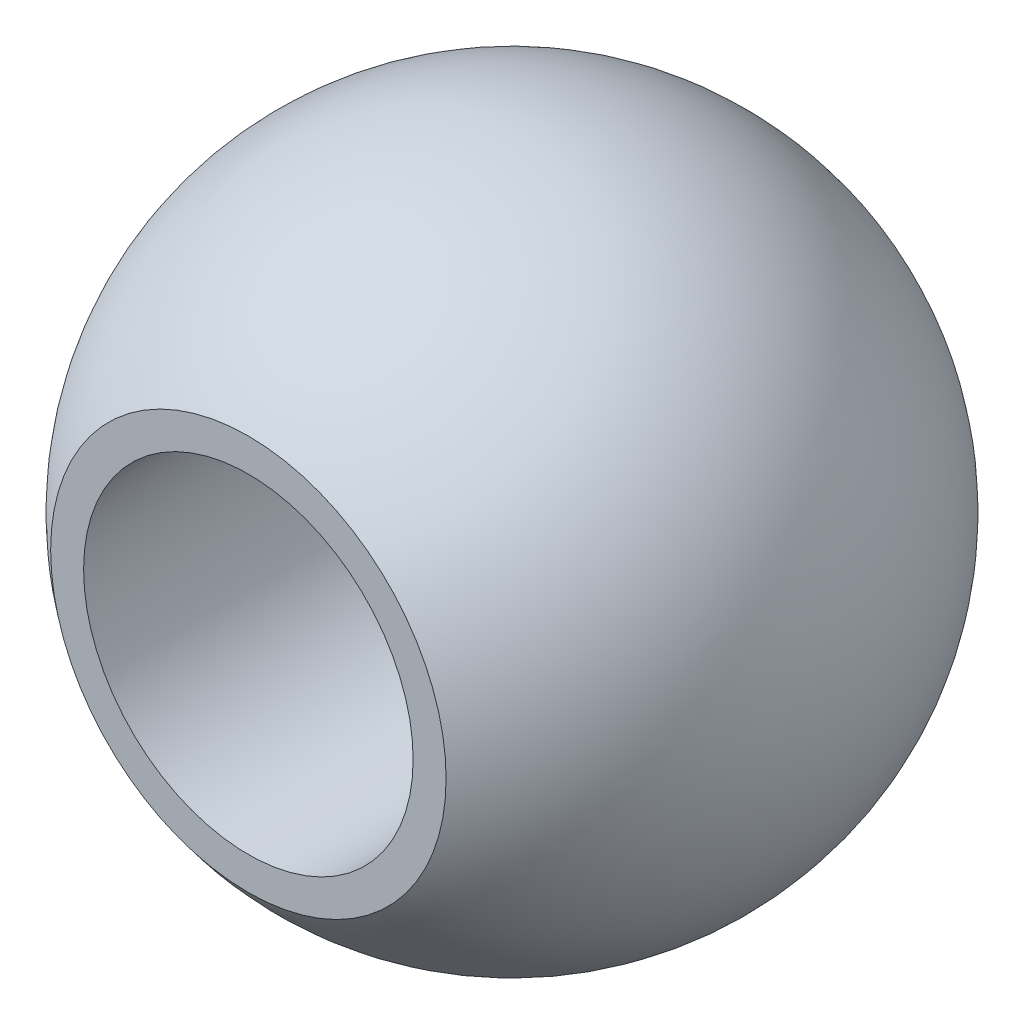
ISO-10303-21;
HEADER;
FILE_DESCRIPTION(('STEP AP214'),'2;1');
FILE_NAME('part.step','',(''),(''),'','','');
FILE_SCHEMA(('AUTOMOTIVE_DESIGN { 1 0 10303 214 1 1 1 1 }'));
ENDSEC;
DATA;
#1=APPLICATION_CONTEXT('core data for automotive mechanical design processes');
#2=APPLICATION_PROTOCOL_DEFINITION('international standard','automotive_design',2000,#1);
#3=PRODUCT_CONTEXT('',#1,'mechanical');
#4=PRODUCT('Part','Part','',(#3));
#5=PRODUCT_RELATED_PRODUCT_CATEGORY('part','',(#4));
#6=PRODUCT_DEFINITION_FORMATION('','',#4);
#7=PRODUCT_DEFINITION_CONTEXT('part definition',#1,'design');
#8=PRODUCT_DEFINITION('design','',#6,#7);
#9=PRODUCT_DEFINITION_SHAPE('','',#8);
#10=(LENGTH_UNIT() NAMED_UNIT(*) SI_UNIT(.MILLI.,.METRE.));
#11=(NAMED_UNIT(*) PLANE_ANGLE_UNIT() SI_UNIT($,.RADIAN.));
#12=(NAMED_UNIT(*) SI_UNIT($,.STERADIAN.) SOLID_ANGLE_UNIT());
#13=UNCERTAINTY_MEASURE_WITH_UNIT(LENGTH_MEASURE(1.E-05),#10,'distance_accuracy_value','');
#14=(GEOMETRIC_REPRESENTATION_CONTEXT(3) GLOBAL_UNCERTAINTY_ASSIGNED_CONTEXT((#13)) GLOBAL_UNIT_ASSIGNED_CONTEXT((#10,
#11,#12)) REPRESENTATION_CONTEXT('',''));
#15=CARTESIAN_POINT('',(0.,0.,0.));
#16=DIRECTION('',(0.,0.,1.));
#17=DIRECTION('',(1.,0.,0.));
#18=AXIS2_PLACEMENT_3D('',#15,#16,#17);
#19=CARTESIAN_POINT('',(0.,0.,-4.));
#20=DIRECTION('',(0.,0.,1.));
#21=DIRECTION('',(1.,0.,0.));
#22=AXIS2_PLACEMENT_3D('',#19,#20,#21);
#23=PLANE('',#22);
#24=CARTESIAN_POINT('',(0.,0.,-4.));
#25=DIRECTION('',(0.,0.,-1.));
#26=DIRECTION('',(-1.,0.,0.));
#27=AXIS2_PLACEMENT_3D('',#24,#25,#26);
#28=CIRCLE('',#27,2.5);
#29=CARTESIAN_POINT('',(-2.5,0.,-4.));
#30=VERTEX_POINT('',#29);
#31=EDGE_CURVE('E48',#30,#30,#28,.T.);
#32=ORIENTED_EDGE('',*,*,#31,.F.);
#33=EDGE_LOOP('',(#32));
#34=FACE_BOUND('',#33,.T.);
#35=CARTESIAN_POINT('',(0.,0.,-4.));
#36=DIRECTION('',(0.,0.,-1.));
#37=DIRECTION('',(-1.,0.,0.));
#38=AXIS2_PLACEMENT_3D('',#35,#36,#37);
#39=CIRCLE('',#38,3.);
#40=CARTESIAN_POINT('',(0.,3.,-4.));
#41=VERTEX_POINT('',#40);
#42=EDGE_CURVE('E10',#41,#41,#39,.T.);
#43=ORIENTED_EDGE('',*,*,#42,.T.);
#44=EDGE_LOOP('',(#43));
#45=FACE_BOUND('',#44,.T.);
#46=ADVANCED_FACE('F34',(#34,#45),#23,.F.);
#47=CARTESIAN_POINT('',(0.,0.,0.));
#48=DIRECTION('',(0.,0.,-1.));
#49=DIRECTION('',(0.,1.,0.));
#50=AXIS2_PLACEMENT_3D('',#47,#48,#49);
#51=SPHERICAL_SURFACE('',#50,5.);
#52=CARTESIAN_POINT('',(0.,0.,4.));
#53=DIRECTION('',(0.,0.,-1.));
#54=DIRECTION('',(-1.,0.,0.));
#55=AXIS2_PLACEMENT_3D('',#52,#53,#54);
#56=CIRCLE('',#55,3.);
#57=CARTESIAN_POINT('',(0.,3.,4.));
#58=VERTEX_POINT('',#57);
#59=EDGE_CURVE('E40',#58,#58,#56,.T.);
#60=CARTESIAN_POINT('',(0.,3.,4.));
#61=CARTESIAN_POINT('',(0.,3.077276775515,3.94204663170657));
#62=CARTESIAN_POINT('',(0.,3.1528698608554,3.88184890774128));
#63=CARTESIAN_POINT('',(0.,3.30044437808252,3.7571782118284));
#64=CARTESIAN_POINT('',(0.,3.37242580996924,3.69270523988082));
#65=CARTESIAN_POINT('',(0.,3.51253274718454,3.55969751136479));
#66=CARTESIAN_POINT('',(0.,3.58065825251311,3.49116275479634));
#67=CARTESIAN_POINT('',(0.,3.7128252611481,3.3502624063782));
#68=CARTESIAN_POINT('',(0.,3.77686676445451,3.2778968145285));
#69=CARTESIAN_POINT('',(0.,3.90065053673076,3.12957757792917));
#70=CARTESIAN_POINT('',(0.,3.96039280570059,3.05362393317954));
#71=CARTESIAN_POINT('',(0.,4.07537754692509,2.89838369785238));
#72=CARTESIAN_POINT('',(0.,4.13062001917976,2.81909710727485));
#73=CARTESIAN_POINT('',(0.,4.23641965218175,2.6574572052343));
#74=CARTESIAN_POINT('',(0.,4.28697681292907,2.57510389377129));
#75=CARTESIAN_POINT('',(0.,4.38323605792731,2.40760709263323));
#76=CARTESIAN_POINT('',(0.,4.42893814217822,2.32246360295818));
#77=CARTESIAN_POINT('',(0.,4.51533376782094,2.1496723520414));
#78=CARTESIAN_POINT('',(0.,4.55602730921274,2.06202459079966));
#79=CARTESIAN_POINT('',(0.,4.63226920242471,1.88451911404273));
#80=CARTESIAN_POINT('',(0.,4.66781755424486,1.79466139852752));
#81=CARTESIAN_POINT('',(0.,4.73364969857936,1.6130377510562));
#82=CARTESIAN_POINT('',(0.,4.76393349109371,1.52127181910009));
#83=CARTESIAN_POINT('',(0.,4.81913482530724,1.3361398843813));
#84=CARTESIAN_POINT('',(0.,4.84405236700642,1.24277388161863));
#85=CARTESIAN_POINT('',(0.,4.88843752767088,1.05475532385498));
#86=CARTESIAN_POINT('',(0.,4.90790514663615,0.960102768854005));
#87=CARTESIAN_POINT('',(0.,4.94132509050021,0.769828945370247));
#88=CARTESIAN_POINT('',(0.,4.95527741539901,0.674207676887465));
#89=CARTESIAN_POINT('',(0.,4.97761991988975,0.482317518088197));
#90=CARTESIAN_POINT('',(0.,4.98601009948169,0.386048627771711));
#91=CARTESIAN_POINT('',(0.,4.99720013953681,0.193186491636817));
#92=CARTESIAN_POINT('',(0.,5.,0.0965932458184087));
#93=CARTESIAN_POINT('',(0.,5.,-0.0965932458184075));
#94=CARTESIAN_POINT('',(0.,4.99720013953681,-0.193186491636816));
#95=CARTESIAN_POINT('',(0.,4.98601009948169,-0.38604862777171));
#96=CARTESIAN_POINT('',(0.,4.97761991988975,-0.482317518088196));
#97=CARTESIAN_POINT('',(0.,4.95527741539901,-0.674207676887464));
#98=CARTESIAN_POINT('',(0.,4.94132509050021,-0.769828945370246));
#99=CARTESIAN_POINT('',(0.,4.90790514663615,-0.960102768854004));
#100=CARTESIAN_POINT('',(0.,4.88843752767088,-1.05475532385498));
#101=CARTESIAN_POINT('',(0.,4.84405236700642,-1.24277388161863));
#102=CARTESIAN_POINT('',(0.,4.81913482530724,-1.3361398843813));
#103=CARTESIAN_POINT('',(0.,4.76393349109371,-1.52127181910009));
#104=CARTESIAN_POINT('',(0.,4.73364969857936,-1.6130377510562));
#105=CARTESIAN_POINT('',(0.,4.66781755424486,-1.79466139852752));
#106=CARTESIAN_POINT('',(0.,4.63226920242471,-1.88451911404272));
#107=CARTESIAN_POINT('',(0.,4.55602730921274,-2.06202459079966));
#108=CARTESIAN_POINT('',(0.,4.51533376782094,-2.1496723520414));
#109=CARTESIAN_POINT('',(0.,4.42893814217822,-2.32246360295818));
#110=CARTESIAN_POINT('',(0.,4.38323605792731,-2.40760709263323));
#111=CARTESIAN_POINT('',(0.,4.28697681292907,-2.57510389377129));
#112=CARTESIAN_POINT('',(0.,4.23641965218176,-2.6574572052343));
#113=CARTESIAN_POINT('',(0.,4.13062001917976,-2.81909710727484));
#114=CARTESIAN_POINT('',(0.,4.07537754692509,-2.89838369785238));
#115=CARTESIAN_POINT('',(0.,3.96039280570059,-3.05362393317954));
#116=CARTESIAN_POINT('',(0.,3.90065053673076,-3.12957757792917));
#117=CARTESIAN_POINT('',(0.,3.77686676445451,-3.2778968145285));
#118=CARTESIAN_POINT('',(0.,3.7128252611481,-3.3502624063782));
#119=CARTESIAN_POINT('',(0.,3.58065825251311,-3.49116275479634));
#120=CARTESIAN_POINT('',(0.,3.51253274718454,-3.55969751136479));
#121=CARTESIAN_POINT('',(0.,3.37242580996924,-3.69270523988082));
#122=CARTESIAN_POINT('',(0.,3.30044437808252,-3.7571782118284));
#123=CARTESIAN_POINT('',(0.,3.1528698608554,-3.88184890774128));
#124=CARTESIAN_POINT('',(0.,3.077276775515,-3.94204663170657));
#125=CARTESIAN_POINT('',(0.,3.,-4.));
#126=B_SPLINE_CURVE_WITH_KNOTS('',3,(#60,#61,#62,#63,#64,#65,#66,#67,#68,#69,#70,#71,#72,#73,
#74,#75,#76,#77,#78,#79,#80,#81,#82,#83,#84,#85,#86,#87,#88,#89,#90,#91,#92,#93,#94,#95,#96,#97,
#98,#99,#100,#101,#102,#103,#104,#105,#106,#107,#108,#109,#110,#111,#112,#113,#114,#115,#116,
#117,#118,#119,#120,#121,#122,#123,#124,#125),.UNSPECIFIED.,.F.,.F.,(4,2,2,2,2,2,2,2,2,2,2,2,2,
2,2,2,2,2,2,2,2,2,2,2,2,2,2,2,2,2,2,2,4),(0.,0.289739201537359,0.579478403074718,
0.869217604612078,1.15895680614944,1.4486960076868,1.73843520922416,2.02817441076152,
2.31791361229888,2.60765281383623,2.89739201537359,3.18713121691095,3.47687041844831,
3.76660961998567,4.05634882152303,4.34608802306039,4.63582722459775,4.92556642613511,
5.21530562767247,5.50504482920983,5.79478403074719,6.08452323228455,6.37426243382191,
6.66400163535927,6.95374083689662,7.24348003843398,7.53321923997134,7.8229584415087,
8.11269764304606,8.40243684458342,8.69217604612078,8.98191524765814,9.2716544491955),.UNSPECIFIED.);
#127=EDGE_CURVE('BSEAM58',#58,#41,#126,.T.);
#128=ORIENTED_EDGE('',*,*,#59,.T.);
#129=ORIENTED_EDGE('',*,*,#42,.F.);
#130=ORIENTED_EDGE('',*,*,#127,.T.);
#131=ORIENTED_EDGE('',*,*,#127,.F.);
#132=EDGE_LOOP('',(#128,#130,#129,#131));
#133=FACE_BOUND('',#132,.T.);
#134=ADVANCED_FACE('F58',(#133),#51,.T.);
#135=CARTESIAN_POINT('',(0.,0.,4.));
#136=DIRECTION('',(0.,0.,1.));
#137=DIRECTION('',(1.,0.,0.));
#138=AXIS2_PLACEMENT_3D('',#135,#136,#137);
#139=PLANE('',#138);
#140=CARTESIAN_POINT('',(0.,0.,4.));
#141=DIRECTION('',(0.,0.,-1.));
#142=DIRECTION('',(-1.,0.,0.));
#143=AXIS2_PLACEMENT_3D('',#140,#141,#142);
#144=CIRCLE('',#143,2.5);
#145=CARTESIAN_POINT('',(-2.5,0.,4.));
#146=VERTEX_POINT('',#145);
#147=EDGE_CURVE('E44',#146,#146,#144,.T.);
#148=ORIENTED_EDGE('',*,*,#147,.T.);
#149=EDGE_LOOP('',(#148));
#150=FACE_BOUND('',#149,.T.);
#151=ORIENTED_EDGE('',*,*,#59,.F.);
#152=EDGE_LOOP('',(#151));
#153=FACE_BOUND('',#152,.T.);
#154=ADVANCED_FACE('F62',(#150,#153),#139,.T.);
#155=CARTESIAN_POINT('',(0.,0.,-10.));
#156=DIRECTION('',(0.,0.,-1.));
#157=DIRECTION('',(-1.,0.,0.));
#158=AXIS2_PLACEMENT_3D('',#155,#156,#157);
#159=CYLINDRICAL_SURFACE('',#158,2.5);
#160=ORIENTED_EDGE('',*,*,#31,.T.);
#161=EDGE_LOOP('',(#160));
#162=FACE_BOUND('',#161,.T.);
#163=ORIENTED_EDGE('',*,*,#147,.F.);
#164=EDGE_LOOP('',(#163));
#165=FACE_BOUND('',#164,.T.);
#166=ADVANCED_FACE('F54',(#162,#165),#159,.F.);
#167=CLOSED_SHELL('',(#46,#134,#154,#166));
#168=MANIFOLD_SOLID_BREP('B2',#167);
#169=ADVANCED_BREP_SHAPE_REPRESENTATION('',(#18,#168),#14);
#170=SHAPE_DEFINITION_REPRESENTATION(#9,#169);
ENDSEC;
END-ISO-10303-21;
